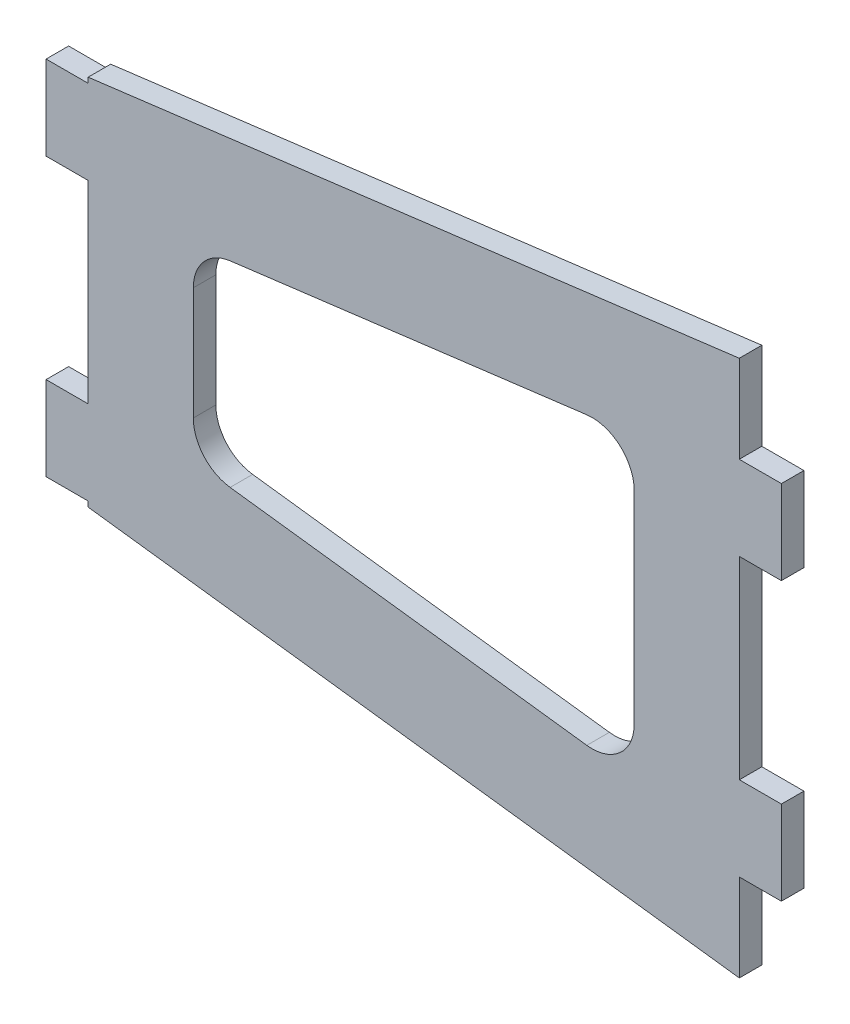
ISO-10303-21;
HEADER;
FILE_DESCRIPTION(('STEP AP214'),'2;1');
FILE_NAME('part.step','',(''),(''),'','','');
FILE_SCHEMA(('AUTOMOTIVE_DESIGN { 1 0 10303 214 1 1 1 1 }'));
ENDSEC;
DATA;
#1=APPLICATION_CONTEXT('core data for automotive mechanical design processes');
#2=APPLICATION_PROTOCOL_DEFINITION('international standard','automotive_design',2000,#1);
#3=PRODUCT_CONTEXT('',#1,'mechanical');
#4=PRODUCT('Part','Part','',(#3));
#5=PRODUCT_RELATED_PRODUCT_CATEGORY('part','',(#4));
#6=PRODUCT_DEFINITION_FORMATION('','',#4);
#7=PRODUCT_DEFINITION_CONTEXT('part definition',#1,'design');
#8=PRODUCT_DEFINITION('design','',#6,#7);
#9=PRODUCT_DEFINITION_SHAPE('','',#8);
#10=(LENGTH_UNIT() NAMED_UNIT(*) SI_UNIT(.MILLI.,.METRE.));
#11=(NAMED_UNIT(*) PLANE_ANGLE_UNIT() SI_UNIT($,.RADIAN.));
#12=(NAMED_UNIT(*) SI_UNIT($,.STERADIAN.) SOLID_ANGLE_UNIT());
#13=UNCERTAINTY_MEASURE_WITH_UNIT(LENGTH_MEASURE(1.E-05),#10,'distance_accuracy_value','');
#14=(GEOMETRIC_REPRESENTATION_CONTEXT(3) GLOBAL_UNCERTAINTY_ASSIGNED_CONTEXT((#13)) GLOBAL_UNIT_ASSIGNED_CONTEXT((#10,
#11,#12)) REPRESENTATION_CONTEXT('',''));
#15=CARTESIAN_POINT('',(0.,0.,0.));
#16=DIRECTION('',(0.,0.,1.));
#17=DIRECTION('',(1.,0.,0.));
#18=AXIS2_PLACEMENT_3D('',#15,#16,#17);
#19=CARTESIAN_POINT('',(0.,0.,3.4036));
#20=DIRECTION('',(0.,0.,-1.));
#21=DIRECTION('',(-1.,0.,0.));
#22=AXIS2_PLACEMENT_3D('',#19,#20,#21);
#23=PLANE('',#22);
#24=DIRECTION('',(0.,1.,0.));
#25=VECTOR('',#24,1.);
#26=CARTESIAN_POINT('',(8672.1772639479,2915.23380461178,3.4036));
#27=LINE('',#26,#25);
#28=CARTESIAN_POINT('',(8672.1772639479,2915.23380461178,3.4036));
#29=VERTEX_POINT('',#28);
#30=CARTESIAN_POINT('',(8672.1772639479,2928.44180461178,3.4036));
#31=VERTEX_POINT('',#30);
#32=EDGE_CURVE('E287',#29,#31,#27,.T.);
#33=ORIENTED_EDGE('',*,*,#32,.T.);
#34=DIRECTION('',(1.,0.,0.));
#35=VECTOR('',#34,1.);
#36=CARTESIAN_POINT('',(8672.1772639479,2928.44180461178,3.4036));
#37=LINE('',#36,#35);
#38=CARTESIAN_POINT('',(8678.5272639479,2928.44180461178,3.4036));
#39=VERTEX_POINT('',#38);
#40=EDGE_CURVE('E290',#31,#39,#37,.T.);
#41=ORIENTED_EDGE('',*,*,#40,.T.);
#42=DIRECTION('',(0.,1.,0.));
#43=VECTOR('',#42,1.);
#44=CARTESIAN_POINT('',(8678.5272639479,2941.14180461178,3.4036));
#45=LINE('',#44,#43);
#46=CARTESIAN_POINT('',(8678.5272639479,2941.14180461178,3.4036));
#47=VERTEX_POINT('',#46);
#48=EDGE_CURVE('E293',#39,#47,#45,.T.);
#49=ORIENTED_EDGE('',*,*,#48,.T.);
#50=DIRECTION('',(-1.,0.,0.));
#51=VECTOR('',#50,1.);
#52=CARTESIAN_POINT('',(8672.1772639479,2941.14180461178,3.4036));
#53=LINE('',#52,#51);
#54=CARTESIAN_POINT('',(8672.1772639479,2941.14180461178,3.4036));
#55=VERTEX_POINT('',#54);
#56=EDGE_CURVE('E295',#47,#55,#53,.T.);
#57=ORIENTED_EDGE('',*,*,#56,.T.);
#58=DIRECTION('',(-1.21626623717911E-13,1.,0.));
#59=VECTOR('',#58,1.);
#60=CARTESIAN_POINT('',(8672.1772639479,2970.35180461179,3.4036));
#61=LINE('',#60,#59);
#62=CARTESIAN_POINT('',(8672.1772639479,2970.35180461179,3.4036));
#63=VERTEX_POINT('',#62);
#64=EDGE_CURVE('E297',#55,#63,#61,.T.);
#65=ORIENTED_EDGE('',*,*,#64,.T.);
#66=DIRECTION('',(1.,0.,0.));
#67=VECTOR('',#66,1.);
#68=CARTESIAN_POINT('',(8672.1772639479,2970.35180461179,3.4036));
#69=LINE('',#68,#67);
#70=CARTESIAN_POINT('',(8678.5272639479,2970.35180461179,3.4036));
#71=VERTEX_POINT('',#70);
#72=EDGE_CURVE('E299',#63,#71,#69,.T.);
#73=ORIENTED_EDGE('',*,*,#72,.T.);
#74=DIRECTION('',(0.,1.,0.));
#75=VECTOR('',#74,1.);
#76=CARTESIAN_POINT('',(8678.5272639479,2983.05180461179,3.4036));
#77=LINE('',#76,#75);
#78=CARTESIAN_POINT('',(8678.5272639479,2983.05180461179,3.4036));
#79=VERTEX_POINT('',#78);
#80=EDGE_CURVE('E301',#71,#79,#77,.T.);
#81=ORIENTED_EDGE('',*,*,#80,.T.);
#82=DIRECTION('',(-1.,0.,0.));
#83=VECTOR('',#82,1.);
#84=CARTESIAN_POINT('',(8672.1772639479,2983.05180461179,3.4036));
#85=LINE('',#84,#83);
#86=CARTESIAN_POINT('',(8672.1772639479,2983.05180461179,3.4036));
#87=VERTEX_POINT('',#86);
#88=EDGE_CURVE('E303',#79,#87,#85,.T.);
#89=ORIENTED_EDGE('',*,*,#88,.T.);
#90=DIRECTION('',(0.,1.,0.));
#91=VECTOR('',#90,1.);
#92=CARTESIAN_POINT('',(8672.1772639479,2996.25980461179,3.4036));
#93=LINE('',#92,#91);
#94=CARTESIAN_POINT('',(8672.1772639479,2996.25980461179,3.4036));
#95=VERTEX_POINT('',#94);
#96=EDGE_CURVE('E305',#87,#95,#93,.T.);
#97=ORIENTED_EDGE('',*,*,#96,.T.);
#98=DIRECTION('',(-0.992128978978878,-0.125220162395397,0.));
#99=VECTOR('',#98,1.);
#100=CARTESIAN_POINT('',(8672.1772639479,2996.25980461179,3.4036));
#101=LINE('',#100,#99);
#102=CARTESIAN_POINT('',(8573.87926394791,2983.85326092247,3.4036));
#103=VERTEX_POINT('',#102);
#104=EDGE_CURVE('E307',#95,#103,#101,.T.);
#105=ORIENTED_EDGE('',*,*,#104,.T.);
#106=DIRECTION('',(-6.64923395971458E-12,-1.,0.));
#107=VECTOR('',#106,1.);
#108=CARTESIAN_POINT('',(8573.8792639479,2983.05180461179,3.4036));
#109=LINE('',#108,#107);
#110=CARTESIAN_POINT('',(8573.8792639479,2983.05180461179,3.4036));
#111=VERTEX_POINT('',#110);
#112=EDGE_CURVE('E309',#103,#111,#109,.T.);
#113=ORIENTED_EDGE('',*,*,#112,.T.);
#114=DIRECTION('',(-1.,0.,0.));
#115=VECTOR('',#114,1.);
#116=CARTESIAN_POINT('',(8567.5292639479,2983.05180461179,3.4036));
#117=LINE('',#116,#115);
#118=CARTESIAN_POINT('',(8567.5292639479,2983.05180461179,3.4036));
#119=VERTEX_POINT('',#118);
#120=EDGE_CURVE('E311',#111,#119,#117,.T.);
#121=ORIENTED_EDGE('',*,*,#120,.T.);
#122=DIRECTION('',(0.,-1.,0.));
#123=VECTOR('',#122,1.);
#124=CARTESIAN_POINT('',(8567.5292639479,2983.05180461179,3.4036));
#125=LINE('',#124,#123);
#126=CARTESIAN_POINT('',(8567.5292639479,2970.35180461179,3.4036));
#127=VERTEX_POINT('',#126);
#128=EDGE_CURVE('E313',#119,#127,#125,.T.);
#129=ORIENTED_EDGE('',*,*,#128,.T.);
#130=DIRECTION('',(1.,0.,0.));
#131=VECTOR('',#130,1.);
#132=CARTESIAN_POINT('',(8567.5292639479,2970.35180461179,3.4036));
#133=LINE('',#132,#131);
#134=CARTESIAN_POINT('',(8573.8792639479,2970.35180461179,3.4036));
#135=VERTEX_POINT('',#134);
#136=EDGE_CURVE('E315',#127,#135,#133,.T.);
#137=ORIENTED_EDGE('',*,*,#136,.T.);
#138=DIRECTION('',(0.,-1.,0.));
#139=VECTOR('',#138,1.);
#140=CARTESIAN_POINT('',(8573.8792639479,2970.35180461179,3.4036));
#141=LINE('',#140,#139);
#142=CARTESIAN_POINT('',(8573.8792639479,2941.14180461178,3.4036));
#143=VERTEX_POINT('',#142);
#144=EDGE_CURVE('E317',#135,#143,#141,.T.);
#145=ORIENTED_EDGE('',*,*,#144,.T.);
#146=DIRECTION('',(-1.,0.,0.));
#147=VECTOR('',#146,1.);
#148=CARTESIAN_POINT('',(8567.5292639479,2941.14180461178,3.4036));
#149=LINE('',#148,#147);
#150=CARTESIAN_POINT('',(8567.5292639479,2941.14180461178,3.4036));
#151=VERTEX_POINT('',#150);
#152=EDGE_CURVE('E319',#143,#151,#149,.T.);
#153=ORIENTED_EDGE('',*,*,#152,.T.);
#154=DIRECTION('',(1.39870617275613E-13,-1.,0.));
#155=VECTOR('',#154,1.);
#156=CARTESIAN_POINT('',(8567.5292639479,2941.14180461178,3.4036));
#157=LINE('',#156,#155);
#158=CARTESIAN_POINT('',(8567.5292639479,2928.44180461178,3.4036));
#159=VERTEX_POINT('',#158);
#160=EDGE_CURVE('E321',#151,#159,#157,.T.);
#161=ORIENTED_EDGE('',*,*,#160,.T.);
#162=DIRECTION('',(1.,0.,0.));
#163=VECTOR('',#162,1.);
#164=CARTESIAN_POINT('',(8567.5292639479,2928.44180461178,3.4036));
#165=LINE('',#164,#163);
#166=CARTESIAN_POINT('',(8573.8792639479,2928.44180461178,3.4036));
#167=VERTEX_POINT('',#166);
#168=EDGE_CURVE('E323',#159,#167,#165,.T.);
#169=ORIENTED_EDGE('',*,*,#168,.T.);
#170=DIRECTION('',(-4.43282263981218E-12,-1.,0.));
#171=VECTOR('',#170,1.);
#172=CARTESIAN_POINT('',(8573.8792639479,2928.44180461178,3.4036));
#173=LINE('',#172,#171);
#174=CARTESIAN_POINT('',(8573.8792639479,2927.6403483011,3.4036));
#175=VERTEX_POINT('',#174);
#176=EDGE_CURVE('E325',#167,#175,#173,.T.);
#177=ORIENTED_EDGE('',*,*,#176,.T.);
#178=DIRECTION('',(0.992128978978879,-0.12522016239539,0.));
#179=VECTOR('',#178,1.);
#180=CARTESIAN_POINT('',(8672.1772639479,2915.23380461178,3.4036));
#181=LINE('',#180,#179);
#182=EDGE_CURVE('E327',#175,#29,#181,.T.);
#183=ORIENTED_EDGE('',*,*,#182,.T.);
#184=EDGE_LOOP('',(#33,#41,#49,#57,#65,#73,#81,#89,#97,#105,#113,#121,#129,#137,#145,#153,#161,
#169,#177,#183));
#185=FACE_BOUND('',#184,.T.);
#186=CARTESIAN_POINT('',(8596.1042639479,2964.25703673922,3.4036));
#187=DIRECTION('',(0.,0.,1.));
#188=DIRECTION('',(1.,0.,0.));
#189=AXIS2_PLACEMENT_3D('',#186,#187,#188);
#190=CIRCLE('',#189,6.34999999999958);
#191=CARTESIAN_POINT('',(8595.30911591669,2970.55705575574,3.4036));
#192=VERTEX_POINT('',#191);
#193=CARTESIAN_POINT('',(8589.7542639479,2964.25703673922,3.4036));
#194=VERTEX_POINT('',#193);
#195=EDGE_CURVE('E222',#192,#194,#190,.T.);
#196=ORIENTED_EDGE('',*,*,#195,.F.);
#197=DIRECTION('',(-0.992128978978878,-0.125220162395391,0.));
#198=VECTOR('',#197,1.);
#199=CARTESIAN_POINT('',(8649.15711591669,2977.3534052703,3.4036));
#200=LINE('',#199,#198);
#201=CARTESIAN_POINT('',(8649.15711591669,2977.3534052703,3.4036));
#202=VERTEX_POINT('',#201);
#203=EDGE_CURVE('E255',#202,#192,#200,.T.);
#204=ORIENTED_EDGE('',*,*,#203,.F.);
#205=CARTESIAN_POINT('',(8649.9522639479,2971.05338625378,3.4036));
#206=DIRECTION('',(0.,0.,1.));
#207=DIRECTION('',(1.,0.,0.));
#208=AXIS2_PLACEMENT_3D('',#205,#206,#207);
#209=CIRCLE('',#208,6.35000000000069);
#210=CARTESIAN_POINT('',(8656.3022639479,2971.05338625379,3.4036));
#211=VERTEX_POINT('',#210);
#212=EDGE_CURVE('E253',#211,#202,#209,.T.);
#213=ORIENTED_EDGE('',*,*,#212,.F.);
#214=DIRECTION('',(0.,1.,0.));
#215=VECTOR('',#214,1.);
#216=CARTESIAN_POINT('',(8656.3022639479,2971.05338625379,3.4036));
#217=LINE('',#216,#215);
#218=CARTESIAN_POINT('',(8656.3022639479,2940.44022296978,3.4036));
#219=VERTEX_POINT('',#218);
#220=EDGE_CURVE('E251',#219,#211,#217,.T.);
#221=ORIENTED_EDGE('',*,*,#220,.F.);
#222=CARTESIAN_POINT('',(8649.9522639479,2940.44022296978,3.4036));
#223=DIRECTION('',(0.,0.,1.));
#224=DIRECTION('',(1.,0.,0.));
#225=AXIS2_PLACEMENT_3D('',#222,#223,#224);
#226=CIRCLE('',#225,6.35000000000058);
#227=CARTESIAN_POINT('',(8649.15711591669,2934.14020395327,3.4036));
#228=VERTEX_POINT('',#227);
#229=EDGE_CURVE('E249',#228,#219,#226,.T.);
#230=ORIENTED_EDGE('',*,*,#229,.F.);
#231=DIRECTION('',(0.992128978978878,-0.125220162395396,0.));
#232=VECTOR('',#231,1.);
#233=CARTESIAN_POINT('',(8649.15711591669,2934.14020395327,3.4036));
#234=LINE('',#233,#232);
#235=CARTESIAN_POINT('',(8595.30911591669,2940.93655346783,3.4036));
#236=VERTEX_POINT('',#235);
#237=EDGE_CURVE('E245',#236,#228,#234,.T.);
#238=ORIENTED_EDGE('',*,*,#237,.F.);
#239=CARTESIAN_POINT('',(8596.1042639479,2947.23657248435,3.4036));
#240=DIRECTION('',(0.,0.,1.));
#241=DIRECTION('',(1.,0.,0.));
#242=AXIS2_PLACEMENT_3D('',#239,#240,#241);
#243=CIRCLE('',#242,6.34999999999958);
#244=CARTESIAN_POINT('',(8589.7542639479,2947.23657248435,3.4036));
#245=VERTEX_POINT('',#244);
#246=EDGE_CURVE('E243',#245,#236,#243,.T.);
#247=ORIENTED_EDGE('',*,*,#246,.F.);
#248=DIRECTION('',(0.,-1.,0.));
#249=VECTOR('',#248,1.);
#250=CARTESIAN_POINT('',(8589.7542639479,2964.25703673922,3.4036));
#251=LINE('',#250,#249);
#252=EDGE_CURVE('E230',#194,#245,#251,.T.);
#253=ORIENTED_EDGE('',*,*,#252,.F.);
#254=EDGE_LOOP('',(#196,#204,#213,#221,#230,#238,#247,#253));
#255=FACE_BOUND('',#254,.T.);
#256=ADVANCED_FACE('F37',(#185,#255),#23,.F.);
#257=CARTESIAN_POINT('',(0.,0.,0.));
#258=DIRECTION('',(0.,0.,-1.));
#259=DIRECTION('',(-1.,0.,0.));
#260=AXIS2_PLACEMENT_3D('',#257,#258,#259);
#261=PLANE('',#260);
#262=DIRECTION('',(0.,1.,0.));
#263=VECTOR('',#262,1.);
#264=CARTESIAN_POINT('',(8672.1772639479,2915.23380461178,0.));
#265=LINE('',#264,#263);
#266=CARTESIAN_POINT('',(8672.1772639479,2915.23380461178,0.));
#267=VERTEX_POINT('',#266);
#268=CARTESIAN_POINT('',(8672.1772639479,2928.44180461178,0.));
#269=VERTEX_POINT('',#268);
#270=EDGE_CURVE('E238',#267,#269,#265,.T.);
#271=ORIENTED_EDGE('',*,*,#270,.F.);
#272=DIRECTION('',(0.992128978978879,-0.12522016239539,0.));
#273=VECTOR('',#272,1.);
#274=CARTESIAN_POINT('',(8672.1772639479,2915.23380461178,0.));
#275=LINE('',#274,#273);
#276=CARTESIAN_POINT('',(8573.8792639479,2927.6403483011,0.));
#277=VERTEX_POINT('',#276);
#278=EDGE_CURVE('E291',#277,#267,#275,.T.);
#279=ORIENTED_EDGE('',*,*,#278,.F.);
#280=DIRECTION('',(-4.43282263981218E-12,-1.,0.));
#281=VECTOR('',#280,1.);
#282=CARTESIAN_POINT('',(8573.8792639479,2928.44180461178,0.));
#283=LINE('',#282,#281);
#284=CARTESIAN_POINT('',(8573.8792639479,2928.44180461178,0.));
#285=VERTEX_POINT('',#284);
#286=EDGE_CURVE('E366',#285,#277,#283,.T.);
#287=ORIENTED_EDGE('',*,*,#286,.F.);
#288=DIRECTION('',(1.,0.,0.));
#289=VECTOR('',#288,1.);
#290=CARTESIAN_POINT('',(8567.5292639479,2928.44180461178,0.));
#291=LINE('',#290,#289);
#292=CARTESIAN_POINT('',(8567.5292639479,2928.44180461178,0.));
#293=VERTEX_POINT('',#292);
#294=EDGE_CURVE('E364',#293,#285,#291,.T.);
#295=ORIENTED_EDGE('',*,*,#294,.F.);
#296=DIRECTION('',(1.39870617275613E-13,-1.,0.));
#297=VECTOR('',#296,1.);
#298=CARTESIAN_POINT('',(8567.5292639479,2941.14180461178,0.));
#299=LINE('',#298,#297);
#300=CARTESIAN_POINT('',(8567.5292639479,2941.14180461178,0.));
#301=VERTEX_POINT('',#300);
#302=EDGE_CURVE('E362',#301,#293,#299,.T.);
#303=ORIENTED_EDGE('',*,*,#302,.F.);
#304=DIRECTION('',(-1.,0.,0.));
#305=VECTOR('',#304,1.);
#306=CARTESIAN_POINT('',(8567.5292639479,2941.14180461178,0.));
#307=LINE('',#306,#305);
#308=CARTESIAN_POINT('',(8573.8792639479,2941.14180461178,0.));
#309=VERTEX_POINT('',#308);
#310=EDGE_CURVE('E360',#309,#301,#307,.T.);
#311=ORIENTED_EDGE('',*,*,#310,.F.);
#312=DIRECTION('',(0.,-1.,0.));
#313=VECTOR('',#312,1.);
#314=CARTESIAN_POINT('',(8573.8792639479,2970.35180461179,0.));
#315=LINE('',#314,#313);
#316=CARTESIAN_POINT('',(8573.8792639479,2970.35180461179,0.));
#317=VERTEX_POINT('',#316);
#318=EDGE_CURVE('E358',#317,#309,#315,.T.);
#319=ORIENTED_EDGE('',*,*,#318,.F.);
#320=DIRECTION('',(1.,0.,0.));
#321=VECTOR('',#320,1.);
#322=CARTESIAN_POINT('',(8567.5292639479,2970.35180461179,0.));
#323=LINE('',#322,#321);
#324=CARTESIAN_POINT('',(8567.5292639479,2970.35180461179,0.));
#325=VERTEX_POINT('',#324);
#326=EDGE_CURVE('E356',#325,#317,#323,.T.);
#327=ORIENTED_EDGE('',*,*,#326,.F.);
#328=DIRECTION('',(0.,-1.,0.));
#329=VECTOR('',#328,1.);
#330=CARTESIAN_POINT('',(8567.5292639479,2983.05180461179,0.));
#331=LINE('',#330,#329);
#332=CARTESIAN_POINT('',(8567.5292639479,2983.05180461179,0.));
#333=VERTEX_POINT('',#332);
#334=EDGE_CURVE('E354',#333,#325,#331,.T.);
#335=ORIENTED_EDGE('',*,*,#334,.F.);
#336=DIRECTION('',(-1.,0.,0.));
#337=VECTOR('',#336,1.);
#338=CARTESIAN_POINT('',(8567.5292639479,2983.05180461179,0.));
#339=LINE('',#338,#337);
#340=CARTESIAN_POINT('',(8573.8792639479,2983.05180461179,0.));
#341=VERTEX_POINT('',#340);
#342=EDGE_CURVE('E352',#341,#333,#339,.T.);
#343=ORIENTED_EDGE('',*,*,#342,.F.);
#344=DIRECTION('',(-6.64923395971458E-12,-1.,0.));
#345=VECTOR('',#344,1.);
#346=CARTESIAN_POINT('',(8573.8792639479,2983.05180461179,0.));
#347=LINE('',#346,#345);
#348=CARTESIAN_POINT('',(8573.87926394791,2983.85326092247,0.));
#349=VERTEX_POINT('',#348);
#350=EDGE_CURVE('E350',#349,#341,#347,.T.);
#351=ORIENTED_EDGE('',*,*,#350,.F.);
#352=DIRECTION('',(-0.992128978978878,-0.125220162395397,0.));
#353=VECTOR('',#352,1.);
#354=CARTESIAN_POINT('',(8672.1772639479,2996.25980461179,0.));
#355=LINE('',#354,#353);
#356=CARTESIAN_POINT('',(8672.1772639479,2996.25980461179,0.));
#357=VERTEX_POINT('',#356);
#358=EDGE_CURVE('E348',#357,#349,#355,.T.);
#359=ORIENTED_EDGE('',*,*,#358,.F.);
#360=DIRECTION('',(0.,1.,0.));
#361=VECTOR('',#360,1.);
#362=CARTESIAN_POINT('',(8672.1772639479,2996.25980461179,0.));
#363=LINE('',#362,#361);
#364=CARTESIAN_POINT('',(8672.1772639479,2983.05180461179,0.));
#365=VERTEX_POINT('',#364);
#366=EDGE_CURVE('E346',#365,#357,#363,.T.);
#367=ORIENTED_EDGE('',*,*,#366,.F.);
#368=DIRECTION('',(-1.,0.,0.));
#369=VECTOR('',#368,1.);
#370=CARTESIAN_POINT('',(8672.1772639479,2983.05180461179,0.));
#371=LINE('',#370,#369);
#372=CARTESIAN_POINT('',(8678.5272639479,2983.05180461179,0.));
#373=VERTEX_POINT('',#372);
#374=EDGE_CURVE('E344',#373,#365,#371,.T.);
#375=ORIENTED_EDGE('',*,*,#374,.F.);
#376=DIRECTION('',(0.,1.,0.));
#377=VECTOR('',#376,1.);
#378=CARTESIAN_POINT('',(8678.5272639479,2983.05180461179,0.));
#379=LINE('',#378,#377);
#380=CARTESIAN_POINT('',(8678.5272639479,2970.35180461179,0.));
#381=VERTEX_POINT('',#380);
#382=EDGE_CURVE('E342',#381,#373,#379,.T.);
#383=ORIENTED_EDGE('',*,*,#382,.F.);
#384=DIRECTION('',(1.,0.,0.));
#385=VECTOR('',#384,1.);
#386=CARTESIAN_POINT('',(8672.1772639479,2970.35180461179,0.));
#387=LINE('',#386,#385);
#388=CARTESIAN_POINT('',(8672.1772639479,2970.35180461179,0.));
#389=VERTEX_POINT('',#388);
#390=EDGE_CURVE('E340',#389,#381,#387,.T.);
#391=ORIENTED_EDGE('',*,*,#390,.F.);
#392=DIRECTION('',(-1.21626623717911E-13,1.,0.));
#393=VECTOR('',#392,1.);
#394=CARTESIAN_POINT('',(8672.1772639479,2970.35180461179,0.));
#395=LINE('',#394,#393);
#396=CARTESIAN_POINT('',(8672.1772639479,2941.14180461178,0.));
#397=VERTEX_POINT('',#396);
#398=EDGE_CURVE('E338',#397,#389,#395,.T.);
#399=ORIENTED_EDGE('',*,*,#398,.F.);
#400=DIRECTION('',(-1.,0.,0.));
#401=VECTOR('',#400,1.);
#402=CARTESIAN_POINT('',(8672.1772639479,2941.14180461178,0.));
#403=LINE('',#402,#401);
#404=CARTESIAN_POINT('',(8678.5272639479,2941.14180461178,0.));
#405=VERTEX_POINT('',#404);
#406=EDGE_CURVE('E336',#405,#397,#403,.T.);
#407=ORIENTED_EDGE('',*,*,#406,.F.);
#408=DIRECTION('',(0.,1.,0.));
#409=VECTOR('',#408,1.);
#410=CARTESIAN_POINT('',(8678.5272639479,2941.14180461178,0.));
#411=LINE('',#410,#409);
#412=CARTESIAN_POINT('',(8678.5272639479,2928.44180461178,0.));
#413=VERTEX_POINT('',#412);
#414=EDGE_CURVE('E334',#413,#405,#411,.T.);
#415=ORIENTED_EDGE('',*,*,#414,.F.);
#416=DIRECTION('',(1.,0.,0.));
#417=VECTOR('',#416,1.);
#418=CARTESIAN_POINT('',(8672.1772639479,2928.44180461178,0.));
#419=LINE('',#418,#417);
#420=EDGE_CURVE('E332',#269,#413,#419,.T.);
#421=ORIENTED_EDGE('',*,*,#420,.F.);
#422=EDGE_LOOP('',(#271,#279,#287,#295,#303,#311,#319,#327,#335,#343,#351,#359,#367,#375,#383,
#391,#399,#407,#415,#421));
#423=FACE_BOUND('',#422,.T.);
#424=DIRECTION('',(-0.992128978978878,-0.125220162395391,0.));
#425=VECTOR('',#424,1.);
#426=CARTESIAN_POINT('',(8649.15711591669,2977.3534052703,0.));
#427=LINE('',#426,#425);
#428=CARTESIAN_POINT('',(8649.15711591669,2977.3534052703,0.));
#429=VERTEX_POINT('',#428);
#430=CARTESIAN_POINT('',(8595.30911591669,2970.55705575574,0.));
#431=VERTEX_POINT('',#430);
#432=EDGE_CURVE('E231',#429,#431,#427,.T.);
#433=ORIENTED_EDGE('',*,*,#432,.T.);
#434=CARTESIAN_POINT('',(8596.1042639479,2964.25703673922,0.));
#435=DIRECTION('',(0.,0.,1.));
#436=DIRECTION('',(1.,0.,0.));
#437=AXIS2_PLACEMENT_3D('',#434,#435,#436);
#438=CIRCLE('',#437,6.34999999999958);
#439=CARTESIAN_POINT('',(8589.7542639479,2964.25703673922,0.));
#440=VERTEX_POINT('',#439);
#441=EDGE_CURVE('E60',#431,#440,#438,.T.);
#442=ORIENTED_EDGE('',*,*,#441,.T.);
#443=DIRECTION('',(0.,-1.,0.));
#444=VECTOR('',#443,1.);
#445=CARTESIAN_POINT('',(8589.7542639479,2964.25703673922,0.));
#446=LINE('',#445,#444);
#447=CARTESIAN_POINT('',(8589.7542639479,2947.23657248435,0.));
#448=VERTEX_POINT('',#447);
#449=EDGE_CURVE('E237',#440,#448,#446,.T.);
#450=ORIENTED_EDGE('',*,*,#449,.T.);
#451=CARTESIAN_POINT('',(8596.1042639479,2947.23657248435,0.));
#452=DIRECTION('',(0.,0.,1.));
#453=DIRECTION('',(1.,0.,0.));
#454=AXIS2_PLACEMENT_3D('',#451,#452,#453);
#455=CIRCLE('',#454,6.34999999999958);
#456=CARTESIAN_POINT('',(8595.30911591669,2940.93655346783,0.));
#457=VERTEX_POINT('',#456);
#458=EDGE_CURVE('E259',#448,#457,#455,.T.);
#459=ORIENTED_EDGE('',*,*,#458,.T.);
#460=DIRECTION('',(0.992128978978878,-0.125220162395396,0.));
#461=VECTOR('',#460,1.);
#462=CARTESIAN_POINT('',(8649.15711591669,2934.14020395327,0.));
#463=LINE('',#462,#461);
#464=CARTESIAN_POINT('',(8649.15711591669,2934.14020395327,0.));
#465=VERTEX_POINT('',#464);
#466=EDGE_CURVE('E262',#457,#465,#463,.T.);
#467=ORIENTED_EDGE('',*,*,#466,.T.);
#468=CARTESIAN_POINT('',(8649.9522639479,2940.44022296978,0.));
#469=DIRECTION('',(0.,0.,1.));
#470=DIRECTION('',(1.,0.,0.));
#471=AXIS2_PLACEMENT_3D('',#468,#469,#470);
#472=CIRCLE('',#471,6.35000000000058);
#473=CARTESIAN_POINT('',(8656.3022639479,2940.44022296978,0.));
#474=VERTEX_POINT('',#473);
#475=EDGE_CURVE('E265',#465,#474,#472,.T.);
#476=ORIENTED_EDGE('',*,*,#475,.T.);
#477=DIRECTION('',(0.,1.,0.));
#478=VECTOR('',#477,1.);
#479=CARTESIAN_POINT('',(8656.3022639479,2971.05338625379,0.));
#480=LINE('',#479,#478);
#481=CARTESIAN_POINT('',(8656.3022639479,2971.05338625379,0.));
#482=VERTEX_POINT('',#481);
#483=EDGE_CURVE('E268',#474,#482,#480,.T.);
#484=ORIENTED_EDGE('',*,*,#483,.T.);
#485=CARTESIAN_POINT('',(8649.9522639479,2971.05338625378,0.));
#486=DIRECTION('',(0.,0.,1.));
#487=DIRECTION('',(1.,0.,0.));
#488=AXIS2_PLACEMENT_3D('',#485,#486,#487);
#489=CIRCLE('',#488,6.35000000000069);
#490=EDGE_CURVE('E271',#482,#429,#489,.T.);
#491=ORIENTED_EDGE('',*,*,#490,.T.);
#492=EDGE_LOOP('',(#433,#442,#450,#459,#467,#476,#484,#491));
#493=FACE_BOUND('',#492,.T.);
#494=ADVANCED_FACE('F432',(#423,#493),#261,.T.);
#495=CARTESIAN_POINT('',(8672.1772639479,2915.23380461178,3.4036));
#496=DIRECTION('',(-1.,0.,0.));
#497=DIRECTION('',(0.,0.,1.));
#498=AXIS2_PLACEMENT_3D('',#495,#496,#497);
#499=PLANE('',#498);
#500=ORIENTED_EDGE('',*,*,#270,.T.);
#501=DIRECTION('',(0.,0.,-1.));
#502=VECTOR('',#501,1.);
#503=CARTESIAN_POINT('',(8672.1772639479,2928.44180461178,3.4036));
#504=LINE('',#503,#502);
#505=EDGE_CURVE('E11',#31,#269,#504,.T.);
#506=ORIENTED_EDGE('',*,*,#505,.F.);
#507=ORIENTED_EDGE('',*,*,#32,.F.);
#508=DIRECTION('',(0.,0.,-1.));
#509=VECTOR('',#508,1.);
#510=CARTESIAN_POINT('',(8672.1772639479,2915.23380461178,3.4036));
#511=LINE('',#510,#509);
#512=EDGE_CURVE('E329',#29,#267,#511,.T.);
#513=ORIENTED_EDGE('',*,*,#512,.T.);
#514=EDGE_LOOP('',(#500,#506,#507,#513));
#515=FACE_BOUND('',#514,.T.);
#516=ADVANCED_FACE('F39',(#515),#499,.F.);
#517=CARTESIAN_POINT('',(8672.1772639479,2928.44180461178,3.4036));
#518=DIRECTION('',(0.,1.,0.));
#519=DIRECTION('',(0.,0.,1.));
#520=AXIS2_PLACEMENT_3D('',#517,#518,#519);
#521=PLANE('',#520);
#522=ORIENTED_EDGE('',*,*,#420,.T.);
#523=DIRECTION('',(0.,0.,-1.));
#524=VECTOR('',#523,1.);
#525=CARTESIAN_POINT('',(8678.5272639479,2928.44180461178,3.4036));
#526=LINE('',#525,#524);
#527=EDGE_CURVE('E45',#39,#413,#526,.T.);
#528=ORIENTED_EDGE('',*,*,#527,.F.);
#529=ORIENTED_EDGE('',*,*,#40,.F.);
#530=ORIENTED_EDGE('',*,*,#505,.T.);
#531=EDGE_LOOP('',(#522,#528,#529,#530));
#532=FACE_BOUND('',#531,.T.);
#533=ADVANCED_FACE('F449',(#532),#521,.F.);
#534=CARTESIAN_POINT('',(8678.5272639479,2941.14180461178,3.4036));
#535=DIRECTION('',(-1.,0.,0.));
#536=DIRECTION('',(0.,0.,1.));
#537=AXIS2_PLACEMENT_3D('',#534,#535,#536);
#538=PLANE('',#537);
#539=ORIENTED_EDGE('',*,*,#414,.T.);
#540=DIRECTION('',(0.,0.,-1.));
#541=VECTOR('',#540,1.);
#542=CARTESIAN_POINT('',(8678.5272639479,2941.14180461178,3.4036));
#543=LINE('',#542,#541);
#544=EDGE_CURVE('E419',#47,#405,#543,.T.);
#545=ORIENTED_EDGE('',*,*,#544,.F.);
#546=ORIENTED_EDGE('',*,*,#48,.F.);
#547=ORIENTED_EDGE('',*,*,#527,.T.);
#548=EDGE_LOOP('',(#539,#545,#546,#547));
#549=FACE_BOUND('',#548,.T.);
#550=ADVANCED_FACE('F426',(#549),#538,.F.);
#551=CARTESIAN_POINT('',(8672.1772639479,2941.14180461178,3.4036));
#552=DIRECTION('',(0.,-1.,0.));
#553=DIRECTION('',(0.,0.,-1.));
#554=AXIS2_PLACEMENT_3D('',#551,#552,#553);
#555=PLANE('',#554);
#556=ORIENTED_EDGE('',*,*,#406,.T.);
#557=DIRECTION('',(0.,0.,-1.));
#558=VECTOR('',#557,1.);
#559=CARTESIAN_POINT('',(8672.1772639479,2941.14180461178,3.4036));
#560=LINE('',#559,#558);
#561=EDGE_CURVE('E416',#55,#397,#560,.T.);
#562=ORIENTED_EDGE('',*,*,#561,.F.);
#563=ORIENTED_EDGE('',*,*,#56,.F.);
#564=ORIENTED_EDGE('',*,*,#544,.T.);
#565=EDGE_LOOP('',(#556,#562,#563,#564));
#566=FACE_BOUND('',#565,.T.);
#567=ADVANCED_FACE('F438',(#566),#555,.F.);
#568=CARTESIAN_POINT('',(8672.1772639479,2970.35180461179,3.4036));
#569=DIRECTION('',(-1.,-1.21626623717911E-13,0.));
#570=DIRECTION('',(1.21626623717911E-13,-1.,0.));
#571=AXIS2_PLACEMENT_3D('',#568,#569,#570);
#572=PLANE('',#571);
#573=ORIENTED_EDGE('',*,*,#398,.T.);
#574=DIRECTION('',(0.,0.,-1.));
#575=VECTOR('',#574,1.);
#576=CARTESIAN_POINT('',(8672.1772639479,2970.35180461179,3.4036));
#577=LINE('',#576,#575);
#578=EDGE_CURVE('E413',#63,#389,#577,.T.);
#579=ORIENTED_EDGE('',*,*,#578,.F.);
#580=ORIENTED_EDGE('',*,*,#64,.F.);
#581=ORIENTED_EDGE('',*,*,#561,.T.);
#582=EDGE_LOOP('',(#573,#579,#580,#581));
#583=FACE_BOUND('',#582,.T.);
#584=ADVANCED_FACE('F442',(#583),#572,.F.);
#585=CARTESIAN_POINT('',(8672.1772639479,2970.35180461179,3.4036));
#586=DIRECTION('',(0.,1.,0.));
#587=DIRECTION('',(0.,0.,1.));
#588=AXIS2_PLACEMENT_3D('',#585,#586,#587);
#589=PLANE('',#588);
#590=ORIENTED_EDGE('',*,*,#390,.T.);
#591=DIRECTION('',(0.,0.,-1.));
#592=VECTOR('',#591,1.);
#593=CARTESIAN_POINT('',(8678.5272639479,2970.35180461179,3.4036));
#594=LINE('',#593,#592);
#595=EDGE_CURVE('E410',#71,#381,#594,.T.);
#596=ORIENTED_EDGE('',*,*,#595,.F.);
#597=ORIENTED_EDGE('',*,*,#72,.F.);
#598=ORIENTED_EDGE('',*,*,#578,.T.);
#599=EDGE_LOOP('',(#590,#596,#597,#598));
#600=FACE_BOUND('',#599,.T.);
#601=ADVANCED_FACE('F522',(#600),#589,.F.);
#602=CARTESIAN_POINT('',(8678.5272639479,2983.05180461179,3.4036));
#603=DIRECTION('',(-1.,0.,0.));
#604=DIRECTION('',(0.,0.,1.));
#605=AXIS2_PLACEMENT_3D('',#602,#603,#604);
#606=PLANE('',#605);
#607=ORIENTED_EDGE('',*,*,#382,.T.);
#608=DIRECTION('',(0.,0.,-1.));
#609=VECTOR('',#608,1.);
#610=CARTESIAN_POINT('',(8678.5272639479,2983.05180461179,3.4036));
#611=LINE('',#610,#609);
#612=EDGE_CURVE('E407',#79,#373,#611,.T.);
#613=ORIENTED_EDGE('',*,*,#612,.F.);
#614=ORIENTED_EDGE('',*,*,#80,.F.);
#615=ORIENTED_EDGE('',*,*,#595,.T.);
#616=EDGE_LOOP('',(#607,#613,#614,#615));
#617=FACE_BOUND('',#616,.T.);
#618=ADVANCED_FACE('F520',(#617),#606,.F.);
#619=CARTESIAN_POINT('',(8672.1772639479,2983.05180461179,3.4036));
#620=DIRECTION('',(0.,-1.,0.));
#621=DIRECTION('',(0.,0.,-1.));
#622=AXIS2_PLACEMENT_3D('',#619,#620,#621);
#623=PLANE('',#622);
#624=ORIENTED_EDGE('',*,*,#374,.T.);
#625=DIRECTION('',(0.,0.,-1.));
#626=VECTOR('',#625,1.);
#627=CARTESIAN_POINT('',(8672.1772639479,2983.05180461179,3.4036));
#628=LINE('',#627,#626);
#629=EDGE_CURVE('E404',#87,#365,#628,.T.);
#630=ORIENTED_EDGE('',*,*,#629,.F.);
#631=ORIENTED_EDGE('',*,*,#88,.F.);
#632=ORIENTED_EDGE('',*,*,#612,.T.);
#633=EDGE_LOOP('',(#624,#630,#631,#632));
#634=FACE_BOUND('',#633,.T.);
#635=ADVANCED_FACE('F515',(#634),#623,.F.);
#636=CARTESIAN_POINT('',(8672.1772639479,2996.25980461179,3.4036));
#637=DIRECTION('',(-1.,0.,0.));
#638=DIRECTION('',(0.,0.,1.));
#639=AXIS2_PLACEMENT_3D('',#636,#637,#638);
#640=PLANE('',#639);
#641=ORIENTED_EDGE('',*,*,#366,.T.);
#642=DIRECTION('',(0.,0.,-1.));
#643=VECTOR('',#642,1.);
#644=CARTESIAN_POINT('',(8672.1772639479,2996.25980461179,3.4036));
#645=LINE('',#644,#643);
#646=EDGE_CURVE('E401',#95,#357,#645,.T.);
#647=ORIENTED_EDGE('',*,*,#646,.F.);
#648=ORIENTED_EDGE('',*,*,#96,.F.);
#649=ORIENTED_EDGE('',*,*,#629,.T.);
#650=EDGE_LOOP('',(#641,#647,#648,#649));
#651=FACE_BOUND('',#650,.T.);
#652=ADVANCED_FACE('F510',(#651),#640,.F.);
#653=CARTESIAN_POINT('',(8672.1772639479,2996.25980461179,3.4036));
#654=DIRECTION('',(0.125220162395397,-0.992128978978878,0.));
#655=DIRECTION('',(0.992128978978878,0.125220162395397,0.));
#656=AXIS2_PLACEMENT_3D('',#653,#654,#655);
#657=PLANE('',#656);
#658=ORIENTED_EDGE('',*,*,#358,.T.);
#659=DIRECTION('',(0.,0.,-1.));
#660=VECTOR('',#659,1.);
#661=CARTESIAN_POINT('',(8573.87926394791,2983.85326092247,3.4036));
#662=LINE('',#661,#660);
#663=EDGE_CURVE('E398',#103,#349,#662,.T.);
#664=ORIENTED_EDGE('',*,*,#663,.F.);
#665=ORIENTED_EDGE('',*,*,#104,.F.);
#666=ORIENTED_EDGE('',*,*,#646,.T.);
#667=EDGE_LOOP('',(#658,#664,#665,#666));
#668=FACE_BOUND('',#667,.T.);
#669=ADVANCED_FACE('F506',(#668),#657,.F.);
#670=CARTESIAN_POINT('',(8573.8792639479,2983.05180461179,3.4036));
#671=DIRECTION('',(1.,-6.64923395971458E-12,0.));
#672=DIRECTION('',(6.64923395971458E-12,1.,0.));
#673=AXIS2_PLACEMENT_3D('',#670,#671,#672);
#674=PLANE('',#673);
#675=ORIENTED_EDGE('',*,*,#350,.T.);
#676=DIRECTION('',(0.,0.,-1.));
#677=VECTOR('',#676,1.);
#678=CARTESIAN_POINT('',(8573.8792639479,2983.05180461179,3.4036));
#679=LINE('',#678,#677);
#680=EDGE_CURVE('E395',#111,#341,#679,.T.);
#681=ORIENTED_EDGE('',*,*,#680,.F.);
#682=ORIENTED_EDGE('',*,*,#112,.F.);
#683=ORIENTED_EDGE('',*,*,#663,.T.);
#684=EDGE_LOOP('',(#675,#681,#682,#683));
#685=FACE_BOUND('',#684,.T.);
#686=ADVANCED_FACE('F501',(#685),#674,.F.);
#687=CARTESIAN_POINT('',(8567.5292639479,2983.05180461179,3.4036));
#688=DIRECTION('',(0.,-1.,0.));
#689=DIRECTION('',(0.,0.,-1.));
#690=AXIS2_PLACEMENT_3D('',#687,#688,#689);
#691=PLANE('',#690);
#692=ORIENTED_EDGE('',*,*,#342,.T.);
#693=DIRECTION('',(0.,0.,-1.));
#694=VECTOR('',#693,1.);
#695=CARTESIAN_POINT('',(8567.5292639479,2983.05180461179,3.4036));
#696=LINE('',#695,#694);
#697=EDGE_CURVE('E392',#119,#333,#696,.T.);
#698=ORIENTED_EDGE('',*,*,#697,.F.);
#699=ORIENTED_EDGE('',*,*,#120,.F.);
#700=ORIENTED_EDGE('',*,*,#680,.T.);
#701=EDGE_LOOP('',(#692,#698,#699,#700));
#702=FACE_BOUND('',#701,.T.);
#703=ADVANCED_FACE('F495',(#702),#691,.F.);
#704=CARTESIAN_POINT('',(8567.5292639479,2983.05180461179,3.4036));
#705=DIRECTION('',(1.,0.,0.));
#706=DIRECTION('',(0.,0.,-1.));
#707=AXIS2_PLACEMENT_3D('',#704,#705,#706);
#708=PLANE('',#707);
#709=ORIENTED_EDGE('',*,*,#334,.T.);
#710=DIRECTION('',(0.,0.,-1.));
#711=VECTOR('',#710,1.);
#712=CARTESIAN_POINT('',(8567.5292639479,2970.35180461179,3.4036));
#713=LINE('',#712,#711);
#714=EDGE_CURVE('E389',#127,#325,#713,.T.);
#715=ORIENTED_EDGE('',*,*,#714,.F.);
#716=ORIENTED_EDGE('',*,*,#128,.F.);
#717=ORIENTED_EDGE('',*,*,#697,.T.);
#718=EDGE_LOOP('',(#709,#715,#716,#717));
#719=FACE_BOUND('',#718,.T.);
#720=ADVANCED_FACE('F491',(#719),#708,.F.);
#721=CARTESIAN_POINT('',(8567.5292639479,2970.35180461179,3.4036));
#722=DIRECTION('',(0.,1.,0.));
#723=DIRECTION('',(0.,0.,1.));
#724=AXIS2_PLACEMENT_3D('',#721,#722,#723);
#725=PLANE('',#724);
#726=ORIENTED_EDGE('',*,*,#326,.T.);
#727=DIRECTION('',(0.,0.,-1.));
#728=VECTOR('',#727,1.);
#729=CARTESIAN_POINT('',(8573.8792639479,2970.35180461179,3.4036));
#730=LINE('',#729,#728);
#731=EDGE_CURVE('E386',#135,#317,#730,.T.);
#732=ORIENTED_EDGE('',*,*,#731,.F.);
#733=ORIENTED_EDGE('',*,*,#136,.F.);
#734=ORIENTED_EDGE('',*,*,#714,.T.);
#735=EDGE_LOOP('',(#726,#732,#733,#734));
#736=FACE_BOUND('',#735,.T.);
#737=ADVANCED_FACE('F486',(#736),#725,.F.);
#738=CARTESIAN_POINT('',(8573.8792639479,2970.35180461179,3.4036));
#739=DIRECTION('',(1.,0.,0.));
#740=DIRECTION('',(0.,0.,-1.));
#741=AXIS2_PLACEMENT_3D('',#738,#739,#740);
#742=PLANE('',#741);
#743=ORIENTED_EDGE('',*,*,#318,.T.);
#744=DIRECTION('',(0.,0.,-1.));
#745=VECTOR('',#744,1.);
#746=CARTESIAN_POINT('',(8573.8792639479,2941.14180461178,3.4036));
#747=LINE('',#746,#745);
#748=EDGE_CURVE('E383',#143,#309,#747,.T.);
#749=ORIENTED_EDGE('',*,*,#748,.F.);
#750=ORIENTED_EDGE('',*,*,#144,.F.);
#751=ORIENTED_EDGE('',*,*,#731,.T.);
#752=EDGE_LOOP('',(#743,#749,#750,#751));
#753=FACE_BOUND('',#752,.T.);
#754=ADVANCED_FACE('F480',(#753),#742,.F.);
#755=CARTESIAN_POINT('',(8567.5292639479,2941.14180461178,3.4036));
#756=DIRECTION('',(0.,-1.,0.));
#757=DIRECTION('',(0.,0.,-1.));
#758=AXIS2_PLACEMENT_3D('',#755,#756,#757);
#759=PLANE('',#758);
#760=ORIENTED_EDGE('',*,*,#310,.T.);
#761=DIRECTION('',(0.,0.,-1.));
#762=VECTOR('',#761,1.);
#763=CARTESIAN_POINT('',(8567.5292639479,2941.14180461178,3.4036));
#764=LINE('',#763,#762);
#765=EDGE_CURVE('E380',#151,#301,#764,.T.);
#766=ORIENTED_EDGE('',*,*,#765,.F.);
#767=ORIENTED_EDGE('',*,*,#152,.F.);
#768=ORIENTED_EDGE('',*,*,#748,.T.);
#769=EDGE_LOOP('',(#760,#766,#767,#768));
#770=FACE_BOUND('',#769,.T.);
#771=ADVANCED_FACE('F476',(#770),#759,.F.);
#772=CARTESIAN_POINT('',(8567.5292639479,2941.14180461178,3.4036));
#773=DIRECTION('',(1.,1.39870617275613E-13,0.));
#774=DIRECTION('',(-1.39870617275613E-13,1.,0.));
#775=AXIS2_PLACEMENT_3D('',#772,#773,#774);
#776=PLANE('',#775);
#777=ORIENTED_EDGE('',*,*,#302,.T.);
#778=DIRECTION('',(0.,0.,-1.));
#779=VECTOR('',#778,1.);
#780=CARTESIAN_POINT('',(8567.5292639479,2928.44180461178,3.4036));
#781=LINE('',#780,#779);
#782=EDGE_CURVE('E377',#159,#293,#781,.T.);
#783=ORIENTED_EDGE('',*,*,#782,.F.);
#784=ORIENTED_EDGE('',*,*,#160,.F.);
#785=ORIENTED_EDGE('',*,*,#765,.T.);
#786=EDGE_LOOP('',(#777,#783,#784,#785));
#787=FACE_BOUND('',#786,.T.);
#788=ADVANCED_FACE('F471',(#787),#776,.F.);
#789=CARTESIAN_POINT('',(8567.5292639479,2928.44180461178,3.4036));
#790=DIRECTION('',(0.,1.,0.));
#791=DIRECTION('',(0.,0.,1.));
#792=AXIS2_PLACEMENT_3D('',#789,#790,#791);
#793=PLANE('',#792);
#794=ORIENTED_EDGE('',*,*,#294,.T.);
#795=DIRECTION('',(0.,0.,-1.));
#796=VECTOR('',#795,1.);
#797=CARTESIAN_POINT('',(8573.8792639479,2928.44180461178,3.4036));
#798=LINE('',#797,#796);
#799=EDGE_CURVE('E374',#167,#285,#798,.T.);
#800=ORIENTED_EDGE('',*,*,#799,.F.);
#801=ORIENTED_EDGE('',*,*,#168,.F.);
#802=ORIENTED_EDGE('',*,*,#782,.T.);
#803=EDGE_LOOP('',(#794,#800,#801,#802));
#804=FACE_BOUND('',#803,.T.);
#805=ADVANCED_FACE('F465',(#804),#793,.F.);
#806=CARTESIAN_POINT('',(8573.8792639479,2928.44180461178,3.4036));
#807=DIRECTION('',(1.,-4.43282263981218E-12,0.));
#808=DIRECTION('',(4.43282263981218E-12,1.,0.));
#809=AXIS2_PLACEMENT_3D('',#806,#807,#808);
#810=PLANE('',#809);
#811=ORIENTED_EDGE('',*,*,#286,.T.);
#812=DIRECTION('',(0.,0.,-1.));
#813=VECTOR('',#812,1.);
#814=CARTESIAN_POINT('',(8573.8792639479,2927.6403483011,3.4036));
#815=LINE('',#814,#813);
#816=EDGE_CURVE('E371',#175,#277,#815,.T.);
#817=ORIENTED_EDGE('',*,*,#816,.F.);
#818=ORIENTED_EDGE('',*,*,#176,.F.);
#819=ORIENTED_EDGE('',*,*,#799,.T.);
#820=EDGE_LOOP('',(#811,#817,#818,#819));
#821=FACE_BOUND('',#820,.T.);
#822=ADVANCED_FACE('F461',(#821),#810,.F.);
#823=CARTESIAN_POINT('',(8672.1772639479,2915.23380461178,3.4036));
#824=DIRECTION('',(0.12522016239539,0.992128978978879,0.));
#825=DIRECTION('',(-0.992128978978879,0.12522016239539,0.));
#826=AXIS2_PLACEMENT_3D('',#823,#824,#825);
#827=PLANE('',#826);
#828=ORIENTED_EDGE('',*,*,#278,.T.);
#829=ORIENTED_EDGE('',*,*,#512,.F.);
#830=ORIENTED_EDGE('',*,*,#182,.F.);
#831=ORIENTED_EDGE('',*,*,#816,.T.);
#832=EDGE_LOOP('',(#828,#829,#830,#831));
#833=FACE_BOUND('',#832,.T.);
#834=ADVANCED_FACE('F456',(#833),#827,.F.);
#835=CARTESIAN_POINT('',(8596.1042639479,2964.25703673922,3.4036));
#836=DIRECTION('',(0.,0.,-1.));
#837=DIRECTION('',(-1.,0.,0.));
#838=AXIS2_PLACEMENT_3D('',#835,#836,#837);
#839=CYLINDRICAL_SURFACE('',#838,6.34999999999958);
#840=ORIENTED_EDGE('',*,*,#441,.F.);
#841=DIRECTION('',(0.,0.,-1.));
#842=VECTOR('',#841,1.);
#843=CARTESIAN_POINT('',(8595.30911591669,2970.55705575574,3.4036));
#844=LINE('',#843,#842);
#845=EDGE_CURVE('E226',#192,#431,#844,.T.);
#846=ORIENTED_EDGE('',*,*,#845,.F.);
#847=ORIENTED_EDGE('',*,*,#195,.T.);
#848=DIRECTION('',(0.,0.,-1.));
#849=VECTOR('',#848,1.);
#850=CARTESIAN_POINT('',(8589.7542639479,2964.25703673922,3.4036));
#851=LINE('',#850,#849);
#852=EDGE_CURVE('E225',#194,#440,#851,.T.);
#853=ORIENTED_EDGE('',*,*,#852,.T.);
#854=EDGE_LOOP('',(#840,#846,#847,#853));
#855=FACE_BOUND('',#854,.T.);
#856=ADVANCED_FACE('F224',(#855),#839,.F.);
#857=CARTESIAN_POINT('',(8589.7542639479,2964.25703673922,3.4036));
#858=DIRECTION('',(1.,0.,0.));
#859=DIRECTION('',(0.,0.,-1.));
#860=AXIS2_PLACEMENT_3D('',#857,#858,#859);
#861=PLANE('',#860);
#862=ORIENTED_EDGE('',*,*,#449,.F.);
#863=ORIENTED_EDGE('',*,*,#852,.F.);
#864=ORIENTED_EDGE('',*,*,#252,.T.);
#865=DIRECTION('',(0.,0.,-1.));
#866=VECTOR('',#865,1.);
#867=CARTESIAN_POINT('',(8589.7542639479,2947.23657248435,3.4036));
#868=LINE('',#867,#866);
#869=EDGE_CURVE('E239',#245,#448,#868,.T.);
#870=ORIENTED_EDGE('',*,*,#869,.T.);
#871=EDGE_LOOP('',(#862,#863,#864,#870));
#872=FACE_BOUND('',#871,.T.);
#873=ADVANCED_FACE('F234',(#872),#861,.T.);
#874=CARTESIAN_POINT('',(8596.1042639479,2947.23657248435,3.4036));
#875=DIRECTION('',(0.,0.,-1.));
#876=DIRECTION('',(-1.,0.,0.));
#877=AXIS2_PLACEMENT_3D('',#874,#875,#876);
#878=CYLINDRICAL_SURFACE('',#877,6.34999999999958);
#879=ORIENTED_EDGE('',*,*,#458,.F.);
#880=ORIENTED_EDGE('',*,*,#869,.F.);
#881=ORIENTED_EDGE('',*,*,#246,.T.);
#882=DIRECTION('',(0.,0.,-1.));
#883=VECTOR('',#882,1.);
#884=CARTESIAN_POINT('',(8595.30911591669,2940.93655346783,3.4036));
#885=LINE('',#884,#883);
#886=EDGE_CURVE('E284',#236,#457,#885,.T.);
#887=ORIENTED_EDGE('',*,*,#886,.T.);
#888=EDGE_LOOP('',(#879,#880,#881,#887));
#889=FACE_BOUND('',#888,.T.);
#890=ADVANCED_FACE('F628',(#889),#878,.F.);
#891=CARTESIAN_POINT('',(8649.15711591669,2934.14020395327,3.4036));
#892=DIRECTION('',(0.125220162395396,0.992128978978878,0.));
#893=DIRECTION('',(-0.992128978978878,0.125220162395396,0.));
#894=AXIS2_PLACEMENT_3D('',#891,#892,#893);
#895=PLANE('',#894);
#896=ORIENTED_EDGE('',*,*,#466,.F.);
#897=ORIENTED_EDGE('',*,*,#886,.F.);
#898=ORIENTED_EDGE('',*,*,#237,.T.);
#899=DIRECTION('',(0.,0.,-1.));
#900=VECTOR('',#899,1.);
#901=CARTESIAN_POINT('',(8649.15711591669,2934.14020395327,3.4036));
#902=LINE('',#901,#900);
#903=EDGE_CURVE('E282',#228,#465,#902,.T.);
#904=ORIENTED_EDGE('',*,*,#903,.T.);
#905=EDGE_LOOP('',(#896,#897,#898,#904));
#906=FACE_BOUND('',#905,.T.);
#907=ADVANCED_FACE('F634',(#906),#895,.T.);
#908=CARTESIAN_POINT('',(8649.9522639479,2940.44022296978,3.4036));
#909=DIRECTION('',(0.,0.,-1.));
#910=DIRECTION('',(-1.,0.,0.));
#911=AXIS2_PLACEMENT_3D('',#908,#909,#910);
#912=CYLINDRICAL_SURFACE('',#911,6.35000000000058);
#913=ORIENTED_EDGE('',*,*,#475,.F.);
#914=ORIENTED_EDGE('',*,*,#903,.F.);
#915=ORIENTED_EDGE('',*,*,#229,.T.);
#916=DIRECTION('',(0.,0.,-1.));
#917=VECTOR('',#916,1.);
#918=CARTESIAN_POINT('',(8656.3022639479,2940.44022296978,3.4036));
#919=LINE('',#918,#917);
#920=EDGE_CURVE('E280',#219,#474,#919,.T.);
#921=ORIENTED_EDGE('',*,*,#920,.T.);
#922=EDGE_LOOP('',(#913,#914,#915,#921));
#923=FACE_BOUND('',#922,.T.);
#924=ADVANCED_FACE('F642',(#923),#912,.F.);
#925=CARTESIAN_POINT('',(8656.3022639479,2971.05338625379,3.4036));
#926=DIRECTION('',(-1.,0.,0.));
#927=DIRECTION('',(0.,0.,1.));
#928=AXIS2_PLACEMENT_3D('',#925,#926,#927);
#929=PLANE('',#928);
#930=ORIENTED_EDGE('',*,*,#483,.F.);
#931=ORIENTED_EDGE('',*,*,#920,.F.);
#932=ORIENTED_EDGE('',*,*,#220,.T.);
#933=DIRECTION('',(0.,0.,-1.));
#934=VECTOR('',#933,1.);
#935=CARTESIAN_POINT('',(8656.3022639479,2971.05338625379,3.4036));
#936=LINE('',#935,#934);
#937=EDGE_CURVE('E278',#211,#482,#936,.T.);
#938=ORIENTED_EDGE('',*,*,#937,.T.);
#939=EDGE_LOOP('',(#930,#931,#932,#938));
#940=FACE_BOUND('',#939,.T.);
#941=ADVANCED_FACE('F650',(#940),#929,.T.);
#942=CARTESIAN_POINT('',(8649.9522639479,2971.05338625378,3.4036));
#943=DIRECTION('',(0.,0.,-1.));
#944=DIRECTION('',(-1.,0.,0.));
#945=AXIS2_PLACEMENT_3D('',#942,#943,#944);
#946=CYLINDRICAL_SURFACE('',#945,6.35000000000069);
#947=ORIENTED_EDGE('',*,*,#490,.F.);
#948=ORIENTED_EDGE('',*,*,#937,.F.);
#949=ORIENTED_EDGE('',*,*,#212,.T.);
#950=DIRECTION('',(0.,0.,-1.));
#951=VECTOR('',#950,1.);
#952=CARTESIAN_POINT('',(8649.15711591669,2977.3534052703,3.4036));
#953=LINE('',#952,#951);
#954=EDGE_CURVE('E52',#202,#429,#953,.T.);
#955=ORIENTED_EDGE('',*,*,#954,.T.);
#956=EDGE_LOOP('',(#947,#948,#949,#955));
#957=FACE_BOUND('',#956,.T.);
#958=ADVANCED_FACE('F658',(#957),#946,.F.);
#959=CARTESIAN_POINT('',(8649.15711591669,2977.3534052703,3.4036));
#960=DIRECTION('',(0.125220162395391,-0.992128978978878,0.));
#961=DIRECTION('',(0.992128978978878,0.125220162395391,0.));
#962=AXIS2_PLACEMENT_3D('',#959,#960,#961);
#963=PLANE('',#962);
#964=ORIENTED_EDGE('',*,*,#432,.F.);
#965=ORIENTED_EDGE('',*,*,#954,.F.);
#966=ORIENTED_EDGE('',*,*,#203,.T.);
#967=ORIENTED_EDGE('',*,*,#845,.T.);
#968=EDGE_LOOP('',(#964,#965,#966,#967));
#969=FACE_BOUND('',#968,.T.);
#970=ADVANCED_FACE('F666',(#969),#963,.T.);
#971=CLOSED_SHELL('',(#256,#494,#516,#533,#550,#567,#584,#601,#618,#635,#652,#669,#686,#703,
#720,#737,#754,#771,#788,#805,#822,#834,#856,#873,#890,#907,#924,#941,#958,#970));
#972=MANIFOLD_SOLID_BREP('B2',#971);
#973=ADVANCED_BREP_SHAPE_REPRESENTATION('',(#18,#972),#14);
#974=SHAPE_DEFINITION_REPRESENTATION(#9,#973);
ENDSEC;
END-ISO-10303-21;
